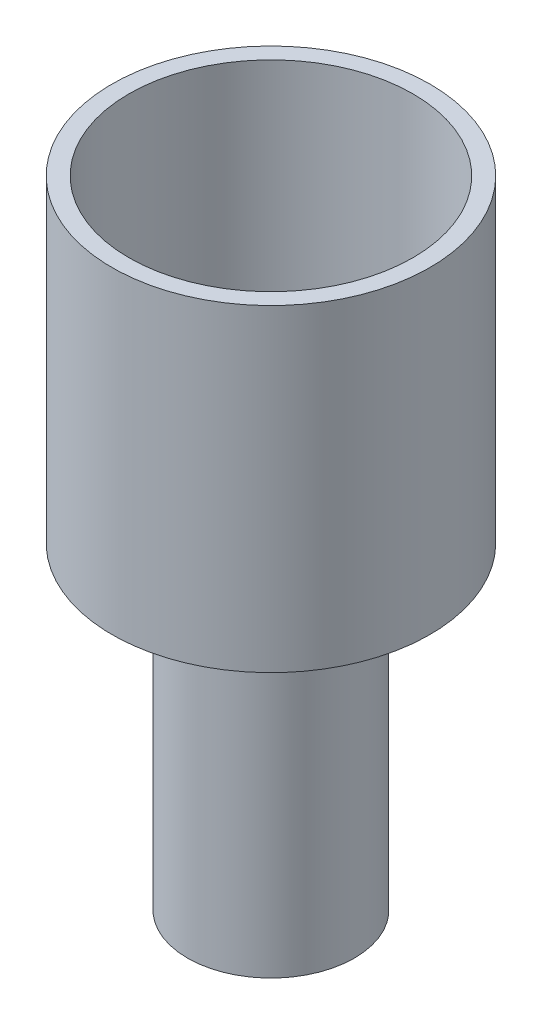
ISO-10303-21;
HEADER;
FILE_DESCRIPTION(('STEP AP214'),'2;1');
FILE_NAME('part.step','',(''),(''),'','','');
FILE_SCHEMA(('AUTOMOTIVE_DESIGN { 1 0 10303 214 1 1 1 1 }'));
ENDSEC;
DATA;
#1=APPLICATION_CONTEXT('core data for automotive mechanical design processes');
#2=APPLICATION_PROTOCOL_DEFINITION('international standard','automotive_design',2000,#1);
#3=PRODUCT_CONTEXT('',#1,'mechanical');
#4=PRODUCT('Part','Part','',(#3));
#5=PRODUCT_RELATED_PRODUCT_CATEGORY('part','',(#4));
#6=PRODUCT_DEFINITION_FORMATION('','',#4);
#7=PRODUCT_DEFINITION_CONTEXT('part definition',#1,'design');
#8=PRODUCT_DEFINITION('design','',#6,#7);
#9=PRODUCT_DEFINITION_SHAPE('','',#8);
#10=(LENGTH_UNIT() NAMED_UNIT(*) SI_UNIT(.MILLI.,.METRE.));
#11=(NAMED_UNIT(*) PLANE_ANGLE_UNIT() SI_UNIT($,.RADIAN.));
#12=(NAMED_UNIT(*) SI_UNIT($,.STERADIAN.) SOLID_ANGLE_UNIT());
#13=UNCERTAINTY_MEASURE_WITH_UNIT(LENGTH_MEASURE(1.E-05),#10,'distance_accuracy_value','');
#14=(GEOMETRIC_REPRESENTATION_CONTEXT(3) GLOBAL_UNCERTAINTY_ASSIGNED_CONTEXT((#13)) GLOBAL_UNIT_ASSIGNED_CONTEXT((#10,
#11,#12)) REPRESENTATION_CONTEXT('',''));
#15=CARTESIAN_POINT('',(0.,0.,0.));
#16=DIRECTION('',(0.,0.,1.));
#17=DIRECTION('',(1.,0.,0.));
#18=AXIS2_PLACEMENT_3D('',#15,#16,#17);
#19=CARTESIAN_POINT('',(0.,-19.05,0.));
#20=DIRECTION('',(0.,-1.,0.));
#21=DIRECTION('',(0.,0.,-1.));
#22=AXIS2_PLACEMENT_3D('',#19,#20,#21);
#23=CYLINDRICAL_SURFACE('',#22,4.36562499999999);
#24=CARTESIAN_POINT('',(0.,-19.05,0.));
#25=DIRECTION('',(0.,-1.,0.));
#26=DIRECTION('',(0.,0.,-1.));
#27=AXIS2_PLACEMENT_3D('',#24,#25,#26);
#28=CIRCLE('',#27,4.365625);
#29=CARTESIAN_POINT('',(0.,-19.05,-4.365625));
#30=VERTEX_POINT('',#29);
#31=EDGE_CURVE('E75',#30,#30,#28,.T.);
#32=ORIENTED_EDGE('',*,*,#31,.T.);
#33=EDGE_LOOP('',(#32));
#34=FACE_BOUND('',#33,.T.);
#35=CARTESIAN_POINT('',(0.,1.27,0.));
#36=DIRECTION('',(0.,1.,0.));
#37=DIRECTION('',(0.,0.,1.));
#38=AXIS2_PLACEMENT_3D('',#35,#36,#37);
#39=CIRCLE('',#38,4.36562499999999);
#40=CARTESIAN_POINT('',(0.,1.27,4.36562499999999));
#41=VERTEX_POINT('',#40);
#42=EDGE_CURVE('E61',#41,#41,#39,.F.);
#43=ORIENTED_EDGE('',*,*,#42,.F.);
#44=EDGE_LOOP('',(#43));
#45=FACE_BOUND('',#44,.T.);
#46=ADVANCED_FACE('F57',(#34,#45),#23,.F.);
#47=CARTESIAN_POINT('',(0.,-19.05,0.));
#48=DIRECTION('',(0.,1.,0.));
#49=DIRECTION('',(0.,0.,1.));
#50=AXIS2_PLACEMENT_3D('',#47,#48,#49);
#51=PLANE('',#50);
#52=CARTESIAN_POINT('',(0.,-19.05,0.));
#53=DIRECTION('',(0.,1.,0.));
#54=DIRECTION('',(0.,0.,1.));
#55=AXIS2_PLACEMENT_3D('',#52,#53,#54);
#56=CIRCLE('',#55,5.);
#57=CARTESIAN_POINT('',(0.,-19.05,5.));
#58=VERTEX_POINT('',#57);
#59=EDGE_CURVE('E70',#58,#58,#56,.T.);
#60=ORIENTED_EDGE('',*,*,#59,.F.);
#61=EDGE_LOOP('',(#60));
#62=FACE_BOUND('',#61,.T.);
#63=ORIENTED_EDGE('',*,*,#31,.F.);
#64=EDGE_LOOP('',(#63));
#65=FACE_BOUND('',#64,.T.);
#66=ADVANCED_FACE('F93',(#62,#65),#51,.F.);
#67=CARTESIAN_POINT('',(0.,0.,0.));
#68=DIRECTION('',(0.,1.,0.));
#69=DIRECTION('',(0.,0.,1.));
#70=AXIS2_PLACEMENT_3D('',#67,#68,#69);
#71=PLANE('',#70);
#72=CARTESIAN_POINT('',(0.,0.,0.));
#73=DIRECTION('',(0.,1.,0.));
#74=DIRECTION('',(0.,0.,1.));
#75=AXIS2_PLACEMENT_3D('',#72,#73,#74);
#76=CIRCLE('',#75,5.);
#77=CARTESIAN_POINT('',(0.,0.,5.));
#78=VERTEX_POINT('',#77);
#79=EDGE_CURVE('E72',#78,#78,#76,.T.);
#80=ORIENTED_EDGE('',*,*,#79,.T.);
#81=EDGE_LOOP('',(#80));
#82=FACE_BOUND('',#81,.T.);
#83=CARTESIAN_POINT('',(0.,0.,0.));
#84=DIRECTION('',(0.,1.,0.));
#85=DIRECTION('',(0.,0.,1.));
#86=AXIS2_PLACEMENT_3D('',#83,#84,#85);
#87=CIRCLE('',#86,9.525);
#88=CARTESIAN_POINT('',(0.,0.,-9.525));
#89=VERTEX_POINT('',#88);
#90=EDGE_CURVE('E65',#89,#89,#87,.T.);
#91=ORIENTED_EDGE('',*,*,#90,.F.);
#92=EDGE_LOOP('',(#91));
#93=FACE_BOUND('',#92,.T.);
#94=ADVANCED_FACE('F100',(#82,#93),#71,.F.);
#95=CARTESIAN_POINT('',(0.,19.05,0.));
#96=DIRECTION('',(0.,-1.,0.));
#97=DIRECTION('',(0.,0.,-1.));
#98=AXIS2_PLACEMENT_3D('',#95,#96,#97);
#99=CYLINDRICAL_SURFACE('',#98,9.525);
#100=CARTESIAN_POINT('',(0.,19.05,0.));
#101=DIRECTION('',(0.,1.,0.));
#102=DIRECTION('',(0.,0.,1.));
#103=AXIS2_PLACEMENT_3D('',#100,#101,#102);
#104=CIRCLE('',#103,9.525);
#105=CARTESIAN_POINT('',(0.,19.05,-9.525));
#106=VERTEX_POINT('',#105);
#107=EDGE_CURVE('E11',#106,#106,#104,.T.);
#108=CARTESIAN_POINT('',(0.,19.05,-9.525));
#109=CARTESIAN_POINT('',(0.,18.8515625,-9.525));
#110=CARTESIAN_POINT('',(0.,18.653125,-9.525));
#111=CARTESIAN_POINT('',(0.,18.25625,-9.525));
#112=CARTESIAN_POINT('',(0.,18.0578125,-9.525));
#113=CARTESIAN_POINT('',(0.,17.6609375,-9.525));
#114=CARTESIAN_POINT('',(0.,17.4625,-9.525));
#115=CARTESIAN_POINT('',(0.,17.065625,-9.525));
#116=CARTESIAN_POINT('',(0.,16.8671875,-9.525));
#117=CARTESIAN_POINT('',(0.,16.4703125,-9.525));
#118=CARTESIAN_POINT('',(0.,16.271875,-9.525));
#119=CARTESIAN_POINT('',(0.,15.875,-9.525));
#120=CARTESIAN_POINT('',(0.,15.6765625,-9.525));
#121=CARTESIAN_POINT('',(0.,15.2796875,-9.525));
#122=CARTESIAN_POINT('',(0.,15.08125,-9.525));
#123=CARTESIAN_POINT('',(0.,14.684375,-9.525));
#124=CARTESIAN_POINT('',(0.,14.4859375,-9.525));
#125=CARTESIAN_POINT('',(0.,14.0890625,-9.525));
#126=CARTESIAN_POINT('',(0.,13.890625,-9.525));
#127=CARTESIAN_POINT('',(0.,13.49375,-9.525));
#128=CARTESIAN_POINT('',(0.,13.2953125,-9.525));
#129=CARTESIAN_POINT('',(0.,12.8984375,-9.525));
#130=CARTESIAN_POINT('',(0.,12.7,-9.525));
#131=CARTESIAN_POINT('',(0.,12.303125,-9.525));
#132=CARTESIAN_POINT('',(0.,12.1046875,-9.525));
#133=CARTESIAN_POINT('',(0.,11.7078125,-9.525));
#134=CARTESIAN_POINT('',(0.,11.509375,-9.525));
#135=CARTESIAN_POINT('',(0.,11.1125,-9.525));
#136=CARTESIAN_POINT('',(0.,10.9140625,-9.525));
#137=CARTESIAN_POINT('',(0.,10.5171875,-9.525));
#138=CARTESIAN_POINT('',(0.,10.31875,-9.525));
#139=CARTESIAN_POINT('',(0.,9.921875,-9.525));
#140=CARTESIAN_POINT('',(0.,9.7234375,-9.525));
#141=CARTESIAN_POINT('',(0.,9.3265625,-9.525));
#142=CARTESIAN_POINT('',(0.,9.128125,-9.525));
#143=CARTESIAN_POINT('',(0.,8.73125,-9.525));
#144=CARTESIAN_POINT('',(0.,8.5328125,-9.525));
#145=CARTESIAN_POINT('',(0.,8.1359375,-9.525));
#146=CARTESIAN_POINT('',(0.,7.9375,-9.525));
#147=CARTESIAN_POINT('',(0.,7.540625,-9.525));
#148=CARTESIAN_POINT('',(0.,7.3421875,-9.525));
#149=CARTESIAN_POINT('',(0.,6.9453125,-9.525));
#150=CARTESIAN_POINT('',(0.,6.746875,-9.525));
#151=CARTESIAN_POINT('',(0.,6.35,-9.525));
#152=CARTESIAN_POINT('',(0.,6.1515625,-9.525));
#153=CARTESIAN_POINT('',(0.,5.7546875,-9.525));
#154=CARTESIAN_POINT('',(0.,5.55625,-9.525));
#155=CARTESIAN_POINT('',(0.,5.159375,-9.525));
#156=CARTESIAN_POINT('',(0.,4.9609375,-9.525));
#157=CARTESIAN_POINT('',(0.,4.5640625,-9.525));
#158=CARTESIAN_POINT('',(0.,4.365625,-9.525));
#159=CARTESIAN_POINT('',(0.,3.96875,-9.525));
#160=CARTESIAN_POINT('',(0.,3.7703125,-9.525));
#161=CARTESIAN_POINT('',(0.,3.3734375,-9.525));
#162=CARTESIAN_POINT('',(0.,3.175,-9.525));
#163=CARTESIAN_POINT('',(0.,2.778125,-9.525));
#164=CARTESIAN_POINT('',(0.,2.5796875,-9.525));
#165=CARTESIAN_POINT('',(0.,2.1828125,-9.525));
#166=CARTESIAN_POINT('',(0.,1.984375,-9.525));
#167=CARTESIAN_POINT('',(0.,1.5875,-9.525));
#168=CARTESIAN_POINT('',(0.,1.3890625,-9.525));
#169=CARTESIAN_POINT('',(0.,0.992187500000001,-9.525));
#170=CARTESIAN_POINT('',(0.,0.793750000000001,-9.525));
#171=CARTESIAN_POINT('',(0.,0.396875,-9.525));
#172=CARTESIAN_POINT('',(0.,0.1984375,-9.525));
#173=CARTESIAN_POINT('',(0.,0.,-9.525));
#174=B_SPLINE_CURVE_WITH_KNOTS('',3,(#108,#109,#110,#111,#112,#113,#114,#115,#116,#117,#118,
#119,#120,#121,#122,#123,#124,#125,#126,#127,#128,#129,#130,#131,#132,#133,#134,#135,#136,#137,
#138,#139,#140,#141,#142,#143,#144,#145,#146,#147,#148,#149,#150,#151,#152,#153,#154,#155,#156,
#157,#158,#159,#160,#161,#162,#163,#164,#165,#166,#167,#168,#169,#170,#171,#172,#173),
.UNSPECIFIED.,.F.,.F.,(4,2,2,2,2,2,2,2,2,2,2,2,2,2,2,2,2,2,2,2,2,2,2,2,2,2,2,2,2,2,2,2,4),(0.,
0.5953125,1.190625,1.7859375,2.38125,2.9765625,3.571875,4.1671875,4.7625,5.3578125,5.953125,
6.5484375,7.14375,7.7390625,8.334375,8.9296875,9.525,10.1203125,10.715625,11.3109375,11.90625,
12.5015625,13.096875,13.6921875,14.2875,14.8828125,15.478125,16.0734375,16.66875,17.2640625,
17.859375,18.4546875,19.05),.UNSPECIFIED.);
#175=EDGE_CURVE('BSEAM59',#106,#89,#174,.T.);
#176=ORIENTED_EDGE('',*,*,#107,.F.);
#177=ORIENTED_EDGE('',*,*,#90,.T.);
#178=ORIENTED_EDGE('',*,*,#175,.T.);
#179=ORIENTED_EDGE('',*,*,#175,.F.);
#180=EDGE_LOOP('',(#176,#178,#177,#179));
#181=FACE_BOUND('',#180,.T.);
#182=ADVANCED_FACE('F59',(#181),#99,.T.);
#183=CARTESIAN_POINT('',(0.,19.05,0.));
#184=DIRECTION('',(0.,1.,0.));
#185=DIRECTION('',(0.,0.,1.));
#186=AXIS2_PLACEMENT_3D('',#183,#184,#185);
#187=PLANE('',#186);
#188=CARTESIAN_POINT('',(0.,19.05,0.));
#189=DIRECTION('',(0.,1.,0.));
#190=DIRECTION('',(0.,0.,1.));
#191=AXIS2_PLACEMENT_3D('',#188,#189,#190);
#192=CIRCLE('',#191,8.509);
#193=CARTESIAN_POINT('',(0.,19.05,8.509));
#194=VERTEX_POINT('',#193);
#195=EDGE_CURVE('E80',#194,#194,#192,.T.);
#196=ORIENTED_EDGE('',*,*,#195,.F.);
#197=EDGE_LOOP('',(#196));
#198=FACE_BOUND('',#197,.T.);
#199=ORIENTED_EDGE('',*,*,#107,.T.);
#200=EDGE_LOOP('',(#199));
#201=FACE_BOUND('',#200,.T.);
#202=ADVANCED_FACE('F110',(#198,#201),#187,.T.);
#203=CARTESIAN_POINT('',(0.,-19.05,0.));
#204=DIRECTION('',(0.,1.,0.));
#205=DIRECTION('',(0.,0.,1.));
#206=AXIS2_PLACEMENT_3D('',#203,#204,#205);
#207=CYLINDRICAL_SURFACE('',#206,5.);
#208=CARTESIAN_POINT('',(0.,-19.05,5.));
#209=CARTESIAN_POINT('',(0.,-18.8515625,5.));
#210=CARTESIAN_POINT('',(0.,-18.653125,5.));
#211=CARTESIAN_POINT('',(0.,-18.25625,5.));
#212=CARTESIAN_POINT('',(0.,-18.0578125,5.));
#213=CARTESIAN_POINT('',(0.,-17.6609375,5.));
#214=CARTESIAN_POINT('',(0.,-17.4625,5.));
#215=CARTESIAN_POINT('',(0.,-17.065625,5.));
#216=CARTESIAN_POINT('',(0.,-16.8671875,5.));
#217=CARTESIAN_POINT('',(0.,-16.4703125,5.));
#218=CARTESIAN_POINT('',(0.,-16.271875,5.));
#219=CARTESIAN_POINT('',(0.,-15.875,5.));
#220=CARTESIAN_POINT('',(0.,-15.6765625,5.));
#221=CARTESIAN_POINT('',(0.,-15.2796875,5.));
#222=CARTESIAN_POINT('',(0.,-15.08125,5.));
#223=CARTESIAN_POINT('',(0.,-14.684375,5.));
#224=CARTESIAN_POINT('',(0.,-14.4859375,5.));
#225=CARTESIAN_POINT('',(0.,-14.0890625,5.));
#226=CARTESIAN_POINT('',(0.,-13.890625,5.));
#227=CARTESIAN_POINT('',(0.,-13.49375,5.));
#228=CARTESIAN_POINT('',(0.,-13.2953125,5.));
#229=CARTESIAN_POINT('',(0.,-12.8984375,5.));
#230=CARTESIAN_POINT('',(0.,-12.7,5.));
#231=CARTESIAN_POINT('',(0.,-12.303125,5.));
#232=CARTESIAN_POINT('',(0.,-12.1046875,5.));
#233=CARTESIAN_POINT('',(0.,-11.7078125,5.));
#234=CARTESIAN_POINT('',(0.,-11.509375,5.));
#235=CARTESIAN_POINT('',(0.,-11.1125,5.));
#236=CARTESIAN_POINT('',(0.,-10.9140625,5.));
#237=CARTESIAN_POINT('',(0.,-10.5171875,5.));
#238=CARTESIAN_POINT('',(0.,-10.31875,5.));
#239=CARTESIAN_POINT('',(0.,-9.921875,5.));
#240=CARTESIAN_POINT('',(0.,-9.7234375,5.));
#241=CARTESIAN_POINT('',(0.,-9.3265625,5.));
#242=CARTESIAN_POINT('',(0.,-9.128125,5.));
#243=CARTESIAN_POINT('',(0.,-8.73125,5.));
#244=CARTESIAN_POINT('',(0.,-8.5328125,5.));
#245=CARTESIAN_POINT('',(0.,-8.1359375,5.));
#246=CARTESIAN_POINT('',(0.,-7.9375,5.));
#247=CARTESIAN_POINT('',(0.,-7.540625,5.));
#248=CARTESIAN_POINT('',(0.,-7.3421875,5.));
#249=CARTESIAN_POINT('',(0.,-6.9453125,5.));
#250=CARTESIAN_POINT('',(0.,-6.746875,5.));
#251=CARTESIAN_POINT('',(0.,-6.35,5.));
#252=CARTESIAN_POINT('',(0.,-6.1515625,5.));
#253=CARTESIAN_POINT('',(0.,-5.7546875,5.));
#254=CARTESIAN_POINT('',(0.,-5.55625,5.));
#255=CARTESIAN_POINT('',(0.,-5.159375,5.));
#256=CARTESIAN_POINT('',(0.,-4.9609375,5.));
#257=CARTESIAN_POINT('',(0.,-4.5640625,5.));
#258=CARTESIAN_POINT('',(0.,-4.365625,5.));
#259=CARTESIAN_POINT('',(0.,-3.96875,5.));
#260=CARTESIAN_POINT('',(0.,-3.7703125,5.));
#261=CARTESIAN_POINT('',(0.,-3.3734375,5.));
#262=CARTESIAN_POINT('',(0.,-3.175,5.));
#263=CARTESIAN_POINT('',(0.,-2.778125,5.));
#264=CARTESIAN_POINT('',(0.,-2.5796875,5.));
#265=CARTESIAN_POINT('',(0.,-2.1828125,5.));
#266=CARTESIAN_POINT('',(0.,-1.984375,5.));
#267=CARTESIAN_POINT('',(0.,-1.5875,5.));
#268=CARTESIAN_POINT('',(0.,-1.3890625,5.));
#269=CARTESIAN_POINT('',(0.,-0.992187500000001,5.));
#270=CARTESIAN_POINT('',(0.,-0.793750000000001,5.));
#271=CARTESIAN_POINT('',(0.,-0.396875,5.));
#272=CARTESIAN_POINT('',(0.,-0.1984375,5.));
#273=CARTESIAN_POINT('',(0.,0.,5.));
#274=B_SPLINE_CURVE_WITH_KNOTS('',3,(#208,#209,#210,#211,#212,#213,#214,#215,#216,#217,#218,
#219,#220,#221,#222,#223,#224,#225,#226,#227,#228,#229,#230,#231,#232,#233,#234,#235,#236,#237,
#238,#239,#240,#241,#242,#243,#244,#245,#246,#247,#248,#249,#250,#251,#252,#253,#254,#255,#256,
#257,#258,#259,#260,#261,#262,#263,#264,#265,#266,#267,#268,#269,#270,#271,#272,#273),
.UNSPECIFIED.,.F.,.F.,(4,2,2,2,2,2,2,2,2,2,2,2,2,2,2,2,2,2,2,2,2,2,2,2,2,2,2,2,2,2,2,2,4),(0.,
0.595312499999997,1.190625,1.7859375,2.38125,2.9765625,3.571875,4.1671875,4.7625,5.3578125,
5.953125,6.5484375,7.14375,7.7390625,8.334375,8.9296875,9.525,10.1203125,10.715625,11.3109375,
11.90625,12.5015625,13.096875,13.6921875,14.2875,14.8828125,15.478125,16.0734375,16.66875,
17.2640625,17.859375,18.4546875,19.05),.UNSPECIFIED.);
#275=EDGE_CURVE('BSEAM107',#58,#78,#274,.T.);
#276=ORIENTED_EDGE('',*,*,#59,.T.);
#277=ORIENTED_EDGE('',*,*,#79,.F.);
#278=ORIENTED_EDGE('',*,*,#275,.T.);
#279=ORIENTED_EDGE('',*,*,#275,.F.);
#280=EDGE_LOOP('',(#276,#278,#277,#279));
#281=FACE_BOUND('',#280,.T.);
#282=ADVANCED_FACE('F107',(#281),#207,.T.);
#283=CARTESIAN_POINT('',(0.,1.27,0.));
#284=DIRECTION('',(0.,1.,0.));
#285=DIRECTION('',(0.,0.,1.));
#286=AXIS2_PLACEMENT_3D('',#283,#284,#285);
#287=PLANE('',#286);
#288=CARTESIAN_POINT('',(0.,1.27,0.));
#289=DIRECTION('',(0.,1.,0.));
#290=DIRECTION('',(0.,0.,1.));
#291=AXIS2_PLACEMENT_3D('',#288,#289,#290);
#292=CIRCLE('',#291,8.509);
#293=CARTESIAN_POINT('',(0.,1.27,8.509));
#294=VERTEX_POINT('',#293);
#295=EDGE_CURVE('E83',#294,#294,#292,.T.);
#296=ORIENTED_EDGE('',*,*,#295,.T.);
#297=EDGE_LOOP('',(#296));
#298=FACE_BOUND('',#297,.T.);
#299=ORIENTED_EDGE('',*,*,#42,.T.);
#300=EDGE_LOOP('',(#299));
#301=FACE_BOUND('',#300,.T.);
#302=ADVANCED_FACE('F90',(#298,#301),#287,.T.);
#303=CARTESIAN_POINT('',(0.,1.27,0.));
#304=DIRECTION('',(0.,1.,0.));
#305=DIRECTION('',(0.,0.,1.));
#306=AXIS2_PLACEMENT_3D('',#303,#304,#305);
#307=CYLINDRICAL_SURFACE('',#306,8.509);
#308=ORIENTED_EDGE('',*,*,#295,.F.);
#309=EDGE_LOOP('',(#308));
#310=FACE_BOUND('',#309,.T.);
#311=ORIENTED_EDGE('',*,*,#195,.T.);
#312=EDGE_LOOP('',(#311));
#313=FACE_BOUND('',#312,.T.);
#314=ADVANCED_FACE('F104',(#310,#313),#307,.F.);
#315=CLOSED_SHELL('',(#46,#66,#94,#182,#202,#282,#302,#314));
#316=MANIFOLD_SOLID_BREP('B2',#315);
#317=ADVANCED_BREP_SHAPE_REPRESENTATION('',(#18,#316),#14);
#318=SHAPE_DEFINITION_REPRESENTATION(#9,#317);
ENDSEC;
END-ISO-10303-21;
